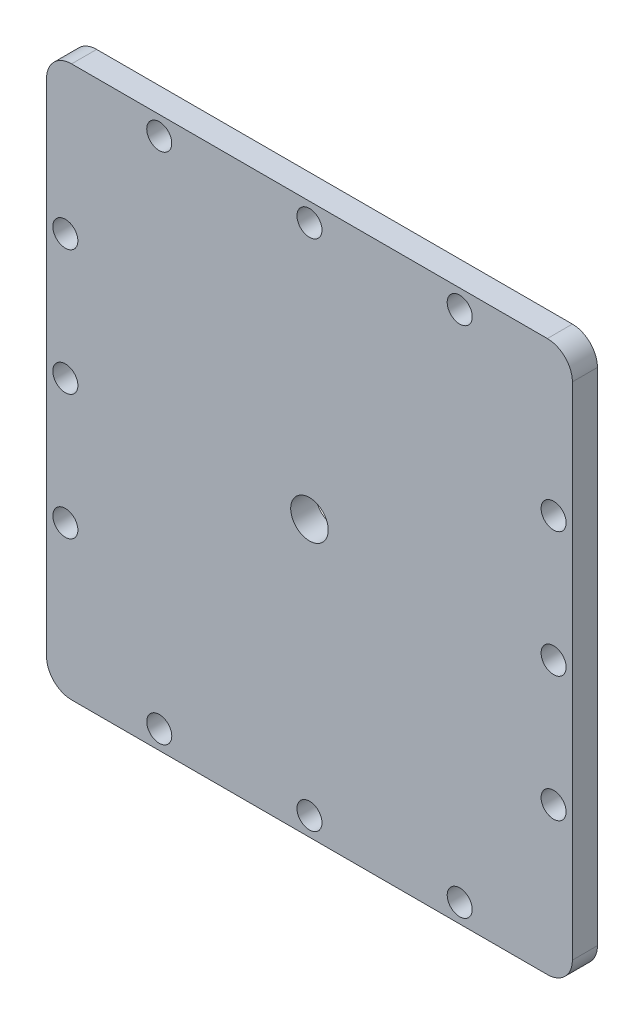
ISO-10303-21;
HEADER;
FILE_DESCRIPTION(('STEP AP214'),'2;1');
FILE_NAME('part.step','',(''),(''),'','','');
FILE_SCHEMA(('AUTOMOTIVE_DESIGN { 1 0 10303 214 1 1 1 1 }'));
ENDSEC;
DATA;
#1=APPLICATION_CONTEXT('core data for automotive mechanical design processes');
#2=APPLICATION_PROTOCOL_DEFINITION('international standard','automotive_design',2000,#1);
#3=PRODUCT_CONTEXT('',#1,'mechanical');
#4=PRODUCT('Part','Part','',(#3));
#5=PRODUCT_RELATED_PRODUCT_CATEGORY('part','',(#4));
#6=PRODUCT_DEFINITION_FORMATION('','',#4);
#7=PRODUCT_DEFINITION_CONTEXT('part definition',#1,'design');
#8=PRODUCT_DEFINITION('design','',#6,#7);
#9=PRODUCT_DEFINITION_SHAPE('','',#8);
#10=(LENGTH_UNIT() NAMED_UNIT(*) SI_UNIT(.MILLI.,.METRE.));
#11=(NAMED_UNIT(*) PLANE_ANGLE_UNIT() SI_UNIT($,.RADIAN.));
#12=(NAMED_UNIT(*) SI_UNIT($,.STERADIAN.) SOLID_ANGLE_UNIT());
#13=UNCERTAINTY_MEASURE_WITH_UNIT(LENGTH_MEASURE(1.E-05),#10,'distance_accuracy_value','');
#14=(GEOMETRIC_REPRESENTATION_CONTEXT(3) GLOBAL_UNCERTAINTY_ASSIGNED_CONTEXT((#13)) GLOBAL_UNIT_ASSIGNED_CONTEXT((#10,
#11,#12)) REPRESENTATION_CONTEXT('',''));
#15=CARTESIAN_POINT('',(0.,0.,0.));
#16=DIRECTION('',(0.,0.,1.));
#17=DIRECTION('',(1.,0.,0.));
#18=AXIS2_PLACEMENT_3D('',#15,#16,#17);
#19=CARTESIAN_POINT('',(95.,100.,10.));
#20=DIRECTION('',(0.,0.,-1.));
#21=DIRECTION('',(-1.,0.,0.));
#22=AXIS2_PLACEMENT_3D('',#19,#20,#21);
#23=PLANE('',#22);
#24=CARTESIAN_POINT('',(0.,0.,10.));
#25=DIRECTION('',(0.,0.,1.));
#26=DIRECTION('',(1.,0.,0.));
#27=AXIS2_PLACEMENT_3D('',#24,#25,#26);
#28=CIRCLE('',#27,7.5);
#29=CARTESIAN_POINT('',(7.5,0.,10.));
#30=VERTEX_POINT('',#29);
#31=EDGE_CURVE('E304',#30,#30,#28,.T.);
#32=ORIENTED_EDGE('',*,*,#31,.F.);
#33=EDGE_LOOP('',(#32));
#34=FACE_BOUND('',#33,.T.);
#35=CARTESIAN_POINT('',(95.,100.,10.));
#36=DIRECTION('',(0.,0.,1.));
#37=DIRECTION('',(-1.,0.,0.));
#38=AXIS2_PLACEMENT_3D('',#35,#36,#37);
#39=CIRCLE('',#38,9.99999999999999);
#40=CARTESIAN_POINT('',(105.,100.,10.));
#41=VERTEX_POINT('',#40);
#42=CARTESIAN_POINT('',(95.,110.,10.));
#43=VERTEX_POINT('',#42);
#44=EDGE_CURVE('E163',#41,#43,#39,.T.);
#45=ORIENTED_EDGE('',*,*,#44,.T.);
#46=DIRECTION('',(-1.,0.,0.));
#47=VECTOR('',#46,1.);
#48=CARTESIAN_POINT('',(-95.,110.,10.));
#49=LINE('',#48,#47);
#50=CARTESIAN_POINT('',(-95.,110.,10.));
#51=VERTEX_POINT('',#50);
#52=EDGE_CURVE('E99',#43,#51,#49,.T.);
#53=ORIENTED_EDGE('',*,*,#52,.T.);
#54=CARTESIAN_POINT('',(-95.,100.,10.));
#55=DIRECTION('',(0.,0.,1.));
#56=DIRECTION('',(-1.,0.,0.));
#57=AXIS2_PLACEMENT_3D('',#54,#55,#56);
#58=CIRCLE('',#57,10.);
#59=CARTESIAN_POINT('',(-105.,100.,10.));
#60=VERTEX_POINT('',#59);
#61=EDGE_CURVE('E184',#51,#60,#58,.T.);
#62=ORIENTED_EDGE('',*,*,#61,.T.);
#63=DIRECTION('',(0.,-1.,0.));
#64=VECTOR('',#63,1.);
#65=CARTESIAN_POINT('',(-105.,-100.,10.));
#66=LINE('',#65,#64);
#67=CARTESIAN_POINT('',(-105.,-100.,10.));
#68=VERTEX_POINT('',#67);
#69=EDGE_CURVE('E198',#60,#68,#66,.T.);
#70=ORIENTED_EDGE('',*,*,#69,.T.);
#71=CARTESIAN_POINT('',(-95.,-100.,10.));
#72=DIRECTION('',(0.,0.,1.));
#73=DIRECTION('',(-1.,0.,0.));
#74=AXIS2_PLACEMENT_3D('',#71,#72,#73);
#75=CIRCLE('',#74,9.99999999999999);
#76=CARTESIAN_POINT('',(-95.,-110.,10.));
#77=VERTEX_POINT('',#76);
#78=EDGE_CURVE('E118',#68,#77,#75,.T.);
#79=ORIENTED_EDGE('',*,*,#78,.T.);
#80=DIRECTION('',(1.,0.,0.));
#81=VECTOR('',#80,1.);
#82=CARTESIAN_POINT('',(-95.,-110.,10.));
#83=LINE('',#82,#81);
#84=CARTESIAN_POINT('',(95.,-110.,10.));
#85=VERTEX_POINT('',#84);
#86=EDGE_CURVE('E112',#77,#85,#83,.T.);
#87=ORIENTED_EDGE('',*,*,#86,.T.);
#88=CARTESIAN_POINT('',(95.,-100.,10.));
#89=DIRECTION('',(0.,0.,1.));
#90=DIRECTION('',(1.,0.,0.));
#91=AXIS2_PLACEMENT_3D('',#88,#89,#90);
#92=CIRCLE('',#91,9.99999999999999);
#93=CARTESIAN_POINT('',(105.,-100.,10.));
#94=VERTEX_POINT('',#93);
#95=EDGE_CURVE('E116',#85,#94,#92,.T.);
#96=ORIENTED_EDGE('',*,*,#95,.T.);
#97=DIRECTION('',(0.,1.,0.));
#98=VECTOR('',#97,1.);
#99=CARTESIAN_POINT('',(105.,-100.,10.));
#100=LINE('',#99,#98);
#101=EDGE_CURVE('E56',#94,#41,#100,.T.);
#102=ORIENTED_EDGE('',*,*,#101,.T.);
#103=EDGE_LOOP('',(#45,#53,#62,#70,#79,#87,#96,#102));
#104=FACE_BOUND('',#103,.T.);
#105=CARTESIAN_POINT('',(97.5,0.,10.));
#106=DIRECTION('',(0.,0.,1.));
#107=DIRECTION('',(1.,0.,0.));
#108=AXIS2_PLACEMENT_3D('',#105,#106,#107);
#109=CIRCLE('',#108,4.99999999999999);
#110=CARTESIAN_POINT('',(102.5,0.,10.));
#111=VERTEX_POINT('',#110);
#112=EDGE_CURVE('E145',#111,#111,#109,.T.);
#113=ORIENTED_EDGE('',*,*,#112,.F.);
#114=EDGE_LOOP('',(#113));
#115=FACE_BOUND('',#114,.T.);
#116=CARTESIAN_POINT('',(0.,102.5,10.));
#117=DIRECTION('',(0.,0.,1.));
#118=DIRECTION('',(1.,0.,0.));
#119=AXIS2_PLACEMENT_3D('',#116,#117,#118);
#120=CIRCLE('',#119,5.00000000000001);
#121=CARTESIAN_POINT('',(5.00000000000001,102.5,10.));
#122=VERTEX_POINT('',#121);
#123=EDGE_CURVE('E212',#122,#122,#120,.T.);
#124=ORIENTED_EDGE('',*,*,#123,.F.);
#125=EDGE_LOOP('',(#124));
#126=FACE_BOUND('',#125,.T.);
#127=CARTESIAN_POINT('',(60.,102.5,10.));
#128=DIRECTION('',(0.,0.,1.));
#129=DIRECTION('',(1.,0.,0.));
#130=AXIS2_PLACEMENT_3D('',#127,#128,#129);
#131=CIRCLE('',#130,5.00000000000002);
#132=CARTESIAN_POINT('',(65.,102.5,10.));
#133=VERTEX_POINT('',#132);
#134=EDGE_CURVE('E220',#133,#133,#131,.T.);
#135=ORIENTED_EDGE('',*,*,#134,.F.);
#136=EDGE_LOOP('',(#135));
#137=FACE_BOUND('',#136,.T.);
#138=CARTESIAN_POINT('',(97.5,50.,10.));
#139=DIRECTION('',(0.,0.,1.));
#140=DIRECTION('',(1.,0.,0.));
#141=AXIS2_PLACEMENT_3D('',#138,#139,#140);
#142=CIRCLE('',#141,4.99999999999999);
#143=CARTESIAN_POINT('',(102.5,50.,10.));
#144=VERTEX_POINT('',#143);
#145=EDGE_CURVE('E228',#144,#144,#142,.T.);
#146=ORIENTED_EDGE('',*,*,#145,.F.);
#147=EDGE_LOOP('',(#146));
#148=FACE_BOUND('',#147,.T.);
#149=CARTESIAN_POINT('',(97.5,-50.0000000000001,10.));
#150=DIRECTION('',(0.,0.,1.));
#151=DIRECTION('',(-1.,0.,0.));
#152=AXIS2_PLACEMENT_3D('',#149,#150,#151);
#153=CIRCLE('',#152,4.99999999999999);
#154=CARTESIAN_POINT('',(92.5,-50.0000000000001,10.));
#155=VERTEX_POINT('',#154);
#156=EDGE_CURVE('E236',#155,#155,#153,.T.);
#157=ORIENTED_EDGE('',*,*,#156,.F.);
#158=EDGE_LOOP('',(#157));
#159=FACE_BOUND('',#158,.T.);
#160=CARTESIAN_POINT('',(60.,-102.5,10.));
#161=DIRECTION('',(0.,0.,1.));
#162=DIRECTION('',(-1.,0.,0.));
#163=AXIS2_PLACEMENT_3D('',#160,#161,#162);
#164=CIRCLE('',#163,5.00000000000002);
#165=CARTESIAN_POINT('',(55.,-102.5,10.));
#166=VERTEX_POINT('',#165);
#167=EDGE_CURVE('E244',#166,#166,#164,.T.);
#168=ORIENTED_EDGE('',*,*,#167,.F.);
#169=EDGE_LOOP('',(#168));
#170=FACE_BOUND('',#169,.T.);
#171=CARTESIAN_POINT('',(0.,-102.5,10.));
#172=DIRECTION('',(0.,0.,1.));
#173=DIRECTION('',(-1.,0.,0.));
#174=AXIS2_PLACEMENT_3D('',#171,#172,#173);
#175=CIRCLE('',#174,5.00000000000001);
#176=CARTESIAN_POINT('',(-5.00000000000001,-102.5,10.));
#177=VERTEX_POINT('',#176);
#178=EDGE_CURVE('E252',#177,#177,#175,.T.);
#179=ORIENTED_EDGE('',*,*,#178,.F.);
#180=EDGE_LOOP('',(#179));
#181=FACE_BOUND('',#180,.T.);
#182=CARTESIAN_POINT('',(-60.,102.5,10.));
#183=DIRECTION('',(0.,0.,1.));
#184=DIRECTION('',(-1.,0.,0.));
#185=AXIS2_PLACEMENT_3D('',#182,#183,#184);
#186=CIRCLE('',#185,5.00000000000001);
#187=CARTESIAN_POINT('',(-65.,102.5,10.));
#188=VERTEX_POINT('',#187);
#189=EDGE_CURVE('E260',#188,#188,#186,.T.);
#190=ORIENTED_EDGE('',*,*,#189,.F.);
#191=EDGE_LOOP('',(#190));
#192=FACE_BOUND('',#191,.T.);
#193=CARTESIAN_POINT('',(-60.,-102.5,10.));
#194=DIRECTION('',(0.,0.,1.));
#195=DIRECTION('',(1.,0.,0.));
#196=AXIS2_PLACEMENT_3D('',#193,#194,#195);
#197=CIRCLE('',#196,5.00000000000001);
#198=CARTESIAN_POINT('',(-55.,-102.5,10.));
#199=VERTEX_POINT('',#198);
#200=EDGE_CURVE('E268',#199,#199,#197,.T.);
#201=ORIENTED_EDGE('',*,*,#200,.F.);
#202=EDGE_LOOP('',(#201));
#203=FACE_BOUND('',#202,.T.);
#204=CARTESIAN_POINT('',(-97.5,-50.0000000000001,10.));
#205=DIRECTION('',(0.,0.,1.));
#206=DIRECTION('',(1.,0.,0.));
#207=AXIS2_PLACEMENT_3D('',#204,#205,#206);
#208=CIRCLE('',#207,5.00000000000001);
#209=CARTESIAN_POINT('',(-92.5,-50.0000000000001,10.));
#210=VERTEX_POINT('',#209);
#211=EDGE_CURVE('E276',#210,#210,#208,.T.);
#212=ORIENTED_EDGE('',*,*,#211,.F.);
#213=EDGE_LOOP('',(#212));
#214=FACE_BOUND('',#213,.T.);
#215=CARTESIAN_POINT('',(-97.5,0.,10.));
#216=DIRECTION('',(0.,0.,1.));
#217=DIRECTION('',(-1.,0.,0.));
#218=AXIS2_PLACEMENT_3D('',#215,#216,#217);
#219=CIRCLE('',#218,5.);
#220=CARTESIAN_POINT('',(-102.5,0.,10.));
#221=VERTEX_POINT('',#220);
#222=EDGE_CURVE('E284',#221,#221,#219,.T.);
#223=ORIENTED_EDGE('',*,*,#222,.F.);
#224=EDGE_LOOP('',(#223));
#225=FACE_BOUND('',#224,.T.);
#226=CARTESIAN_POINT('',(-97.5,50.,10.));
#227=DIRECTION('',(0.,0.,1.));
#228=DIRECTION('',(-1.,0.,0.));
#229=AXIS2_PLACEMENT_3D('',#226,#227,#228);
#230=CIRCLE('',#229,5.00000000000001);
#231=CARTESIAN_POINT('',(-102.5,50.,10.));
#232=VERTEX_POINT('',#231);
#233=EDGE_CURVE('E292',#232,#232,#230,.T.);
#234=ORIENTED_EDGE('',*,*,#233,.F.);
#235=EDGE_LOOP('',(#234));
#236=FACE_BOUND('',#235,.T.);
#237=ADVANCED_FACE('F38',(#34,#104,#115,#126,#137,#148,#159,#170,#181,#192,#203,#214,#225,#236),
#23,.F.);
#238=CARTESIAN_POINT('',(95.,100.,0.));
#239=DIRECTION('',(0.,0.,-1.));
#240=DIRECTION('',(-1.,0.,0.));
#241=AXIS2_PLACEMENT_3D('',#238,#239,#240);
#242=PLANE('',#241);
#243=CARTESIAN_POINT('',(0.,0.,0.));
#244=DIRECTION('',(0.,0.,1.));
#245=DIRECTION('',(1.,0.,0.));
#246=AXIS2_PLACEMENT_3D('',#243,#244,#245);
#247=CIRCLE('',#246,7.5);
#248=CARTESIAN_POINT('',(7.5,0.,0.));
#249=VERTEX_POINT('',#248);
#250=EDGE_CURVE('E300',#249,#249,#247,.T.);
#251=ORIENTED_EDGE('',*,*,#250,.T.);
#252=EDGE_LOOP('',(#251));
#253=FACE_BOUND('',#252,.T.);
#254=CARTESIAN_POINT('',(-97.5,0.,0.));
#255=DIRECTION('',(0.,0.,1.));
#256=DIRECTION('',(-1.,0.,0.));
#257=AXIS2_PLACEMENT_3D('',#254,#255,#256);
#258=CIRCLE('',#257,5.);
#259=CARTESIAN_POINT('',(-102.5,0.,0.));
#260=VERTEX_POINT('',#259);
#261=EDGE_CURVE('E288',#260,#260,#258,.T.);
#262=ORIENTED_EDGE('',*,*,#261,.T.);
#263=EDGE_LOOP('',(#262));
#264=FACE_BOUND('',#263,.T.);
#265=CARTESIAN_POINT('',(-60.,-102.5,0.));
#266=DIRECTION('',(0.,0.,1.));
#267=DIRECTION('',(1.,0.,0.));
#268=AXIS2_PLACEMENT_3D('',#265,#266,#267);
#269=CIRCLE('',#268,5.00000000000001);
#270=CARTESIAN_POINT('',(-55.,-102.5,0.));
#271=VERTEX_POINT('',#270);
#272=EDGE_CURVE('E272',#271,#271,#269,.T.);
#273=ORIENTED_EDGE('',*,*,#272,.T.);
#274=EDGE_LOOP('',(#273));
#275=FACE_BOUND('',#274,.T.);
#276=CARTESIAN_POINT('',(0.,-102.5,0.));
#277=DIRECTION('',(0.,0.,1.));
#278=DIRECTION('',(-1.,0.,0.));
#279=AXIS2_PLACEMENT_3D('',#276,#277,#278);
#280=CIRCLE('',#279,5.00000000000001);
#281=CARTESIAN_POINT('',(-5.00000000000001,-102.5,0.));
#282=VERTEX_POINT('',#281);
#283=EDGE_CURVE('E256',#282,#282,#280,.T.);
#284=ORIENTED_EDGE('',*,*,#283,.T.);
#285=EDGE_LOOP('',(#284));
#286=FACE_BOUND('',#285,.T.);
#287=CARTESIAN_POINT('',(97.5,-50.0000000000001,0.));
#288=DIRECTION('',(0.,0.,1.));
#289=DIRECTION('',(-1.,0.,0.));
#290=AXIS2_PLACEMENT_3D('',#287,#288,#289);
#291=CIRCLE('',#290,4.99999999999999);
#292=CARTESIAN_POINT('',(92.5,-50.0000000000001,0.));
#293=VERTEX_POINT('',#292);
#294=EDGE_CURVE('E240',#293,#293,#291,.T.);
#295=ORIENTED_EDGE('',*,*,#294,.T.);
#296=EDGE_LOOP('',(#295));
#297=FACE_BOUND('',#296,.T.);
#298=CARTESIAN_POINT('',(60.,102.5,0.));
#299=DIRECTION('',(0.,0.,1.));
#300=DIRECTION('',(1.,0.,0.));
#301=AXIS2_PLACEMENT_3D('',#298,#299,#300);
#302=CIRCLE('',#301,5.00000000000002);
#303=CARTESIAN_POINT('',(65.,102.5,0.));
#304=VERTEX_POINT('',#303);
#305=EDGE_CURVE('E224',#304,#304,#302,.T.);
#306=ORIENTED_EDGE('',*,*,#305,.T.);
#307=EDGE_LOOP('',(#306));
#308=FACE_BOUND('',#307,.T.);
#309=CARTESIAN_POINT('',(97.5,0.,0.));
#310=DIRECTION('',(0.,0.,1.));
#311=DIRECTION('',(1.,0.,0.));
#312=AXIS2_PLACEMENT_3D('',#309,#310,#311);
#313=CIRCLE('',#312,4.99999999999999);
#314=CARTESIAN_POINT('',(102.5,0.,0.));
#315=VERTEX_POINT('',#314);
#316=EDGE_CURVE('E208',#315,#315,#313,.T.);
#317=ORIENTED_EDGE('',*,*,#316,.T.);
#318=EDGE_LOOP('',(#317));
#319=FACE_BOUND('',#318,.T.);
#320=CARTESIAN_POINT('',(95.,100.,0.));
#321=DIRECTION('',(0.,0.,1.));
#322=DIRECTION('',(-1.,0.,0.));
#323=AXIS2_PLACEMENT_3D('',#320,#321,#322);
#324=CIRCLE('',#323,9.99999999999999);
#325=CARTESIAN_POINT('',(105.,100.,0.));
#326=VERTEX_POINT('',#325);
#327=CARTESIAN_POINT('',(95.,110.,0.));
#328=VERTEX_POINT('',#327);
#329=EDGE_CURVE('E140',#326,#328,#324,.T.);
#330=ORIENTED_EDGE('',*,*,#329,.F.);
#331=DIRECTION('',(0.,1.,0.));
#332=VECTOR('',#331,1.);
#333=CARTESIAN_POINT('',(105.,-100.,0.));
#334=LINE('',#333,#332);
#335=CARTESIAN_POINT('',(105.,-100.,0.));
#336=VERTEX_POINT('',#335);
#337=EDGE_CURVE('E91',#336,#326,#334,.T.);
#338=ORIENTED_EDGE('',*,*,#337,.F.);
#339=CARTESIAN_POINT('',(95.,-100.,0.));
#340=DIRECTION('',(0.,0.,1.));
#341=DIRECTION('',(1.,0.,0.));
#342=AXIS2_PLACEMENT_3D('',#339,#340,#341);
#343=CIRCLE('',#342,9.99999999999999);
#344=CARTESIAN_POINT('',(95.,-110.,0.));
#345=VERTEX_POINT('',#344);
#346=EDGE_CURVE('E85',#345,#336,#343,.T.);
#347=ORIENTED_EDGE('',*,*,#346,.F.);
#348=DIRECTION('',(1.,0.,0.));
#349=VECTOR('',#348,1.);
#350=CARTESIAN_POINT('',(-95.,-110.,0.));
#351=LINE('',#350,#349);
#352=CARTESIAN_POINT('',(-95.,-110.,0.));
#353=VERTEX_POINT('',#352);
#354=EDGE_CURVE('E127',#353,#345,#351,.T.);
#355=ORIENTED_EDGE('',*,*,#354,.F.);
#356=CARTESIAN_POINT('',(-95.,-100.,0.));
#357=DIRECTION('',(0.,0.,1.));
#358=DIRECTION('',(-1.,0.,0.));
#359=AXIS2_PLACEMENT_3D('',#356,#357,#358);
#360=CIRCLE('',#359,9.99999999999999);
#361=CARTESIAN_POINT('',(-105.,-100.,0.));
#362=VERTEX_POINT('',#361);
#363=EDGE_CURVE('E154',#362,#353,#360,.T.);
#364=ORIENTED_EDGE('',*,*,#363,.F.);
#365=DIRECTION('',(0.,-1.,0.));
#366=VECTOR('',#365,1.);
#367=CARTESIAN_POINT('',(-105.,-100.,0.));
#368=LINE('',#367,#366);
#369=CARTESIAN_POINT('',(-105.,100.,0.));
#370=VERTEX_POINT('',#369);
#371=EDGE_CURVE('E151',#370,#362,#368,.T.);
#372=ORIENTED_EDGE('',*,*,#371,.F.);
#373=CARTESIAN_POINT('',(-95.,100.,0.));
#374=DIRECTION('',(0.,0.,1.));
#375=DIRECTION('',(-1.,0.,0.));
#376=AXIS2_PLACEMENT_3D('',#373,#374,#375);
#377=CIRCLE('',#376,10.);
#378=CARTESIAN_POINT('',(-95.,110.,0.));
#379=VERTEX_POINT('',#378);
#380=EDGE_CURVE('E148',#379,#370,#377,.T.);
#381=ORIENTED_EDGE('',*,*,#380,.F.);
#382=DIRECTION('',(-1.,0.,0.));
#383=VECTOR('',#382,1.);
#384=CARTESIAN_POINT('',(-95.,110.,0.));
#385=LINE('',#384,#383);
#386=EDGE_CURVE('E144',#328,#379,#385,.T.);
#387=ORIENTED_EDGE('',*,*,#386,.F.);
#388=EDGE_LOOP('',(#330,#338,#347,#355,#364,#372,#381,#387));
#389=FACE_BOUND('',#388,.T.);
#390=CARTESIAN_POINT('',(0.,102.5,0.));
#391=DIRECTION('',(0.,0.,1.));
#392=DIRECTION('',(1.,0.,0.));
#393=AXIS2_PLACEMENT_3D('',#390,#391,#392);
#394=CIRCLE('',#393,5.00000000000001);
#395=CARTESIAN_POINT('',(5.00000000000001,102.5,0.));
#396=VERTEX_POINT('',#395);
#397=EDGE_CURVE('E216',#396,#396,#394,.T.);
#398=ORIENTED_EDGE('',*,*,#397,.T.);
#399=EDGE_LOOP('',(#398));
#400=FACE_BOUND('',#399,.T.);
#401=CARTESIAN_POINT('',(97.5,50.,0.));
#402=DIRECTION('',(0.,0.,1.));
#403=DIRECTION('',(1.,0.,0.));
#404=AXIS2_PLACEMENT_3D('',#401,#402,#403);
#405=CIRCLE('',#404,4.99999999999999);
#406=CARTESIAN_POINT('',(102.5,50.,0.));
#407=VERTEX_POINT('',#406);
#408=EDGE_CURVE('E232',#407,#407,#405,.T.);
#409=ORIENTED_EDGE('',*,*,#408,.T.);
#410=EDGE_LOOP('',(#409));
#411=FACE_BOUND('',#410,.T.);
#412=CARTESIAN_POINT('',(60.,-102.5,0.));
#413=DIRECTION('',(0.,0.,1.));
#414=DIRECTION('',(-1.,0.,0.));
#415=AXIS2_PLACEMENT_3D('',#412,#413,#414);
#416=CIRCLE('',#415,5.00000000000002);
#417=CARTESIAN_POINT('',(55.,-102.5,0.));
#418=VERTEX_POINT('',#417);
#419=EDGE_CURVE('E248',#418,#418,#416,.T.);
#420=ORIENTED_EDGE('',*,*,#419,.T.);
#421=EDGE_LOOP('',(#420));
#422=FACE_BOUND('',#421,.T.);
#423=CARTESIAN_POINT('',(-60.,102.5,0.));
#424=DIRECTION('',(0.,0.,1.));
#425=DIRECTION('',(-1.,0.,0.));
#426=AXIS2_PLACEMENT_3D('',#423,#424,#425);
#427=CIRCLE('',#426,5.00000000000001);
#428=CARTESIAN_POINT('',(-65.,102.5,0.));
#429=VERTEX_POINT('',#428);
#430=EDGE_CURVE('E264',#429,#429,#427,.T.);
#431=ORIENTED_EDGE('',*,*,#430,.T.);
#432=EDGE_LOOP('',(#431));
#433=FACE_BOUND('',#432,.T.);
#434=CARTESIAN_POINT('',(-97.5,-50.0000000000001,0.));
#435=DIRECTION('',(0.,0.,1.));
#436=DIRECTION('',(1.,0.,0.));
#437=AXIS2_PLACEMENT_3D('',#434,#435,#436);
#438=CIRCLE('',#437,5.00000000000001);
#439=CARTESIAN_POINT('',(-92.5,-50.0000000000001,0.));
#440=VERTEX_POINT('',#439);
#441=EDGE_CURVE('E280',#440,#440,#438,.T.);
#442=ORIENTED_EDGE('',*,*,#441,.T.);
#443=EDGE_LOOP('',(#442));
#444=FACE_BOUND('',#443,.T.);
#445=CARTESIAN_POINT('',(-97.5,50.,0.));
#446=DIRECTION('',(0.,0.,1.));
#447=DIRECTION('',(-1.,0.,0.));
#448=AXIS2_PLACEMENT_3D('',#445,#446,#447);
#449=CIRCLE('',#448,5.00000000000001);
#450=CARTESIAN_POINT('',(-102.5,50.,0.));
#451=VERTEX_POINT('',#450);
#452=EDGE_CURVE('E296',#451,#451,#449,.T.);
#453=ORIENTED_EDGE('',*,*,#452,.T.);
#454=EDGE_LOOP('',(#453));
#455=FACE_BOUND('',#454,.T.);
#456=ADVANCED_FACE('F188',(#253,#264,#275,#286,#297,#308,#319,#389,#400,#411,#422,#433,#444,
#455),#242,.T.);
#457=CARTESIAN_POINT('',(95.,100.,10.));
#458=DIRECTION('',(0.,0.,-1.));
#459=DIRECTION('',(-1.,0.,0.));
#460=AXIS2_PLACEMENT_3D('',#457,#458,#459);
#461=CYLINDRICAL_SURFACE('',#460,9.99999999999999);
#462=ORIENTED_EDGE('',*,*,#329,.T.);
#463=DIRECTION('',(0.,0.,-1.));
#464=VECTOR('',#463,1.);
#465=CARTESIAN_POINT('',(95.,110.,10.));
#466=LINE('',#465,#464);
#467=EDGE_CURVE('E11',#43,#328,#466,.T.);
#468=ORIENTED_EDGE('',*,*,#467,.F.);
#469=ORIENTED_EDGE('',*,*,#44,.F.);
#470=DIRECTION('',(0.,0.,-1.));
#471=VECTOR('',#470,1.);
#472=CARTESIAN_POINT('',(105.,100.,10.));
#473=LINE('',#472,#471);
#474=EDGE_CURVE('E136',#41,#326,#473,.T.);
#475=ORIENTED_EDGE('',*,*,#474,.T.);
#476=EDGE_LOOP('',(#462,#468,#469,#475));
#477=FACE_BOUND('',#476,.T.);
#478=ADVANCED_FACE('F40',(#477),#461,.T.);
#479=CARTESIAN_POINT('',(-95.,110.,10.));
#480=DIRECTION('',(0.,-1.,0.));
#481=DIRECTION('',(0.,0.,-1.));
#482=AXIS2_PLACEMENT_3D('',#479,#480,#481);
#483=PLANE('',#482);
#484=ORIENTED_EDGE('',*,*,#386,.T.);
#485=DIRECTION('',(0.,0.,-1.));
#486=VECTOR('',#485,1.);
#487=CARTESIAN_POINT('',(-95.,110.,10.));
#488=LINE('',#487,#486);
#489=EDGE_CURVE('E48',#51,#379,#488,.T.);
#490=ORIENTED_EDGE('',*,*,#489,.F.);
#491=ORIENTED_EDGE('',*,*,#52,.F.);
#492=ORIENTED_EDGE('',*,*,#467,.T.);
#493=EDGE_LOOP('',(#484,#490,#491,#492));
#494=FACE_BOUND('',#493,.T.);
#495=ADVANCED_FACE('F344',(#494),#483,.F.);
#496=CARTESIAN_POINT('',(-95.,100.,10.));
#497=DIRECTION('',(0.,0.,-1.));
#498=DIRECTION('',(-1.,0.,0.));
#499=AXIS2_PLACEMENT_3D('',#496,#497,#498);
#500=CYLINDRICAL_SURFACE('',#499,10.);
#501=ORIENTED_EDGE('',*,*,#380,.T.);
#502=DIRECTION('',(0.,0.,-1.));
#503=VECTOR('',#502,1.);
#504=CARTESIAN_POINT('',(-105.,100.,10.));
#505=LINE('',#504,#503);
#506=EDGE_CURVE('E174',#60,#370,#505,.T.);
#507=ORIENTED_EDGE('',*,*,#506,.F.);
#508=ORIENTED_EDGE('',*,*,#61,.F.);
#509=ORIENTED_EDGE('',*,*,#489,.T.);
#510=EDGE_LOOP('',(#501,#507,#508,#509));
#511=FACE_BOUND('',#510,.T.);
#512=ADVANCED_FACE('F182',(#511),#500,.T.);
#513=CARTESIAN_POINT('',(-105.,-100.,10.));
#514=DIRECTION('',(1.,0.,0.));
#515=DIRECTION('',(0.,0.,-1.));
#516=AXIS2_PLACEMENT_3D('',#513,#514,#515);
#517=PLANE('',#516);
#518=ORIENTED_EDGE('',*,*,#371,.T.);
#519=DIRECTION('',(0.,0.,-1.));
#520=VECTOR('',#519,1.);
#521=CARTESIAN_POINT('',(-105.,-100.,10.));
#522=LINE('',#521,#520);
#523=EDGE_CURVE('E170',#68,#362,#522,.T.);
#524=ORIENTED_EDGE('',*,*,#523,.F.);
#525=ORIENTED_EDGE('',*,*,#69,.F.);
#526=ORIENTED_EDGE('',*,*,#506,.T.);
#527=EDGE_LOOP('',(#518,#524,#525,#526));
#528=FACE_BOUND('',#527,.T.);
#529=ADVANCED_FACE('F193',(#528),#517,.F.);
#530=CARTESIAN_POINT('',(-95.,-100.,10.));
#531=DIRECTION('',(0.,0.,-1.));
#532=DIRECTION('',(-1.,0.,0.));
#533=AXIS2_PLACEMENT_3D('',#530,#531,#532);
#534=CYLINDRICAL_SURFACE('',#533,9.99999999999999);
#535=ORIENTED_EDGE('',*,*,#363,.T.);
#536=DIRECTION('',(0.,0.,-1.));
#537=VECTOR('',#536,1.);
#538=CARTESIAN_POINT('',(-95.,-110.,10.));
#539=LINE('',#538,#537);
#540=EDGE_CURVE('E129',#77,#353,#539,.T.);
#541=ORIENTED_EDGE('',*,*,#540,.F.);
#542=ORIENTED_EDGE('',*,*,#78,.F.);
#543=ORIENTED_EDGE('',*,*,#523,.T.);
#544=EDGE_LOOP('',(#535,#541,#542,#543));
#545=FACE_BOUND('',#544,.T.);
#546=ADVANCED_FACE('F196',(#545),#534,.T.);
#547=CARTESIAN_POINT('',(-95.,-110.,10.));
#548=DIRECTION('',(0.,1.,0.));
#549=DIRECTION('',(0.,0.,1.));
#550=AXIS2_PLACEMENT_3D('',#547,#548,#549);
#551=PLANE('',#550);
#552=ORIENTED_EDGE('',*,*,#354,.T.);
#553=DIRECTION('',(0.,0.,-1.));
#554=VECTOR('',#553,1.);
#555=CARTESIAN_POINT('',(95.,-110.,10.));
#556=LINE('',#555,#554);
#557=EDGE_CURVE('E124',#85,#345,#556,.T.);
#558=ORIENTED_EDGE('',*,*,#557,.F.);
#559=ORIENTED_EDGE('',*,*,#86,.F.);
#560=ORIENTED_EDGE('',*,*,#540,.T.);
#561=EDGE_LOOP('',(#552,#558,#559,#560));
#562=FACE_BOUND('',#561,.T.);
#563=ADVANCED_FACE('F125',(#562),#551,.F.);
#564=CARTESIAN_POINT('',(95.,-100.,10.));
#565=DIRECTION('',(0.,0.,-1.));
#566=DIRECTION('',(-1.,0.,0.));
#567=AXIS2_PLACEMENT_3D('',#564,#565,#566);
#568=CYLINDRICAL_SURFACE('',#567,9.99999999999999);
#569=ORIENTED_EDGE('',*,*,#346,.T.);
#570=DIRECTION('',(0.,0.,-1.));
#571=VECTOR('',#570,1.);
#572=CARTESIAN_POINT('',(105.,-100.,10.));
#573=LINE('',#572,#571);
#574=EDGE_CURVE('E130',#94,#336,#573,.T.);
#575=ORIENTED_EDGE('',*,*,#574,.F.);
#576=ORIENTED_EDGE('',*,*,#95,.F.);
#577=ORIENTED_EDGE('',*,*,#557,.T.);
#578=EDGE_LOOP('',(#569,#575,#576,#577));
#579=FACE_BOUND('',#578,.T.);
#580=ADVANCED_FACE('F132',(#579),#568,.T.);
#581=CARTESIAN_POINT('',(105.,-100.,10.));
#582=DIRECTION('',(-1.,0.,0.));
#583=DIRECTION('',(0.,0.,1.));
#584=AXIS2_PLACEMENT_3D('',#581,#582,#583);
#585=PLANE('',#584);
#586=ORIENTED_EDGE('',*,*,#337,.T.);
#587=ORIENTED_EDGE('',*,*,#474,.F.);
#588=ORIENTED_EDGE('',*,*,#101,.F.);
#589=ORIENTED_EDGE('',*,*,#574,.T.);
#590=EDGE_LOOP('',(#586,#587,#588,#589));
#591=FACE_BOUND('',#590,.T.);
#592=ADVANCED_FACE('F332',(#591),#585,.F.);
#593=CARTESIAN_POINT('',(97.5,0.,10.));
#594=DIRECTION('',(0.,0.,-1.));
#595=DIRECTION('',(-1.,0.,0.));
#596=AXIS2_PLACEMENT_3D('',#593,#594,#595);
#597=CYLINDRICAL_SURFACE('',#596,4.99999999999999);
#598=ORIENTED_EDGE('',*,*,#112,.T.);
#599=EDGE_LOOP('',(#598));
#600=FACE_BOUND('',#599,.T.);
#601=ORIENTED_EDGE('',*,*,#316,.F.);
#602=EDGE_LOOP('',(#601));
#603=FACE_BOUND('',#602,.T.);
#604=ADVANCED_FACE('F329',(#600,#603),#597,.F.);
#605=CARTESIAN_POINT('',(0.,102.5,10.));
#606=DIRECTION('',(0.,0.,-1.));
#607=DIRECTION('',(-1.,0.,0.));
#608=AXIS2_PLACEMENT_3D('',#605,#606,#607);
#609=CYLINDRICAL_SURFACE('',#608,5.00000000000001);
#610=ORIENTED_EDGE('',*,*,#123,.T.);
#611=EDGE_LOOP('',(#610));
#612=FACE_BOUND('',#611,.T.);
#613=ORIENTED_EDGE('',*,*,#397,.F.);
#614=EDGE_LOOP('',(#613));
#615=FACE_BOUND('',#614,.T.);
#616=ADVANCED_FACE('F447',(#612,#615),#609,.F.);
#617=CARTESIAN_POINT('',(60.,102.5,10.));
#618=DIRECTION('',(0.,0.,-1.));
#619=DIRECTION('',(-1.,0.,0.));
#620=AXIS2_PLACEMENT_3D('',#617,#618,#619);
#621=CYLINDRICAL_SURFACE('',#620,5.00000000000002);
#622=ORIENTED_EDGE('',*,*,#134,.T.);
#623=EDGE_LOOP('',(#622));
#624=FACE_BOUND('',#623,.T.);
#625=ORIENTED_EDGE('',*,*,#305,.F.);
#626=EDGE_LOOP('',(#625));
#627=FACE_BOUND('',#626,.T.);
#628=ADVANCED_FACE('F439',(#624,#627),#621,.F.);
#629=CARTESIAN_POINT('',(97.5,50.,10.));
#630=DIRECTION('',(0.,0.,-1.));
#631=DIRECTION('',(-1.,0.,0.));
#632=AXIS2_PLACEMENT_3D('',#629,#630,#631);
#633=CYLINDRICAL_SURFACE('',#632,4.99999999999999);
#634=ORIENTED_EDGE('',*,*,#145,.T.);
#635=EDGE_LOOP('',(#634));
#636=FACE_BOUND('',#635,.T.);
#637=ORIENTED_EDGE('',*,*,#408,.F.);
#638=EDGE_LOOP('',(#637));
#639=FACE_BOUND('',#638,.T.);
#640=ADVANCED_FACE('F431',(#636,#639),#633,.F.);
#641=CARTESIAN_POINT('',(97.5,-50.0000000000001,10.));
#642=DIRECTION('',(0.,0.,-1.));
#643=DIRECTION('',(-1.,0.,0.));
#644=AXIS2_PLACEMENT_3D('',#641,#642,#643);
#645=CYLINDRICAL_SURFACE('',#644,4.99999999999999);
#646=ORIENTED_EDGE('',*,*,#156,.T.);
#647=EDGE_LOOP('',(#646));
#648=FACE_BOUND('',#647,.T.);
#649=ORIENTED_EDGE('',*,*,#294,.F.);
#650=EDGE_LOOP('',(#649));
#651=FACE_BOUND('',#650,.T.);
#652=ADVANCED_FACE('F423',(#648,#651),#645,.F.);
#653=CARTESIAN_POINT('',(60.,-102.5,10.));
#654=DIRECTION('',(0.,0.,-1.));
#655=DIRECTION('',(-1.,0.,0.));
#656=AXIS2_PLACEMENT_3D('',#653,#654,#655);
#657=CYLINDRICAL_SURFACE('',#656,5.00000000000002);
#658=ORIENTED_EDGE('',*,*,#167,.T.);
#659=EDGE_LOOP('',(#658));
#660=FACE_BOUND('',#659,.T.);
#661=ORIENTED_EDGE('',*,*,#419,.F.);
#662=EDGE_LOOP('',(#661));
#663=FACE_BOUND('',#662,.T.);
#664=ADVANCED_FACE('F415',(#660,#663),#657,.F.);
#665=CARTESIAN_POINT('',(0.,-102.5,10.));
#666=DIRECTION('',(0.,0.,-1.));
#667=DIRECTION('',(-1.,0.,0.));
#668=AXIS2_PLACEMENT_3D('',#665,#666,#667);
#669=CYLINDRICAL_SURFACE('',#668,5.00000000000001);
#670=ORIENTED_EDGE('',*,*,#178,.T.);
#671=EDGE_LOOP('',(#670));
#672=FACE_BOUND('',#671,.T.);
#673=ORIENTED_EDGE('',*,*,#283,.F.);
#674=EDGE_LOOP('',(#673));
#675=FACE_BOUND('',#674,.T.);
#676=ADVANCED_FACE('F407',(#672,#675),#669,.F.);
#677=CARTESIAN_POINT('',(-60.,102.5,10.));
#678=DIRECTION('',(0.,0.,-1.));
#679=DIRECTION('',(-1.,0.,0.));
#680=AXIS2_PLACEMENT_3D('',#677,#678,#679);
#681=CYLINDRICAL_SURFACE('',#680,5.00000000000001);
#682=ORIENTED_EDGE('',*,*,#189,.T.);
#683=EDGE_LOOP('',(#682));
#684=FACE_BOUND('',#683,.T.);
#685=ORIENTED_EDGE('',*,*,#430,.F.);
#686=EDGE_LOOP('',(#685));
#687=FACE_BOUND('',#686,.T.);
#688=ADVANCED_FACE('F399',(#684,#687),#681,.F.);
#689=CARTESIAN_POINT('',(-60.,-102.5,10.));
#690=DIRECTION('',(0.,0.,-1.));
#691=DIRECTION('',(-1.,0.,0.));
#692=AXIS2_PLACEMENT_3D('',#689,#690,#691);
#693=CYLINDRICAL_SURFACE('',#692,5.00000000000001);
#694=ORIENTED_EDGE('',*,*,#200,.T.);
#695=EDGE_LOOP('',(#694));
#696=FACE_BOUND('',#695,.T.);
#697=ORIENTED_EDGE('',*,*,#272,.F.);
#698=EDGE_LOOP('',(#697));
#699=FACE_BOUND('',#698,.T.);
#700=ADVANCED_FACE('F391',(#696,#699),#693,.F.);
#701=CARTESIAN_POINT('',(-97.5,-50.0000000000001,10.));
#702=DIRECTION('',(0.,0.,-1.));
#703=DIRECTION('',(-1.,0.,0.));
#704=AXIS2_PLACEMENT_3D('',#701,#702,#703);
#705=CYLINDRICAL_SURFACE('',#704,5.00000000000001);
#706=ORIENTED_EDGE('',*,*,#211,.T.);
#707=EDGE_LOOP('',(#706));
#708=FACE_BOUND('',#707,.T.);
#709=ORIENTED_EDGE('',*,*,#441,.F.);
#710=EDGE_LOOP('',(#709));
#711=FACE_BOUND('',#710,.T.);
#712=ADVANCED_FACE('F383',(#708,#711),#705,.F.);
#713=CARTESIAN_POINT('',(-97.5,0.,10.));
#714=DIRECTION('',(0.,0.,-1.));
#715=DIRECTION('',(-1.,0.,0.));
#716=AXIS2_PLACEMENT_3D('',#713,#714,#715);
#717=CYLINDRICAL_SURFACE('',#716,5.);
#718=ORIENTED_EDGE('',*,*,#222,.T.);
#719=EDGE_LOOP('',(#718));
#720=FACE_BOUND('',#719,.T.);
#721=ORIENTED_EDGE('',*,*,#261,.F.);
#722=EDGE_LOOP('',(#721));
#723=FACE_BOUND('',#722,.T.);
#724=ADVANCED_FACE('F376',(#720,#723),#717,.F.);
#725=CARTESIAN_POINT('',(-97.5,50.,10.));
#726=DIRECTION('',(0.,0.,-1.));
#727=DIRECTION('',(-1.,0.,0.));
#728=AXIS2_PLACEMENT_3D('',#725,#726,#727);
#729=CYLINDRICAL_SURFACE('',#728,5.00000000000001);
#730=ORIENTED_EDGE('',*,*,#233,.T.);
#731=EDGE_LOOP('',(#730));
#732=FACE_BOUND('',#731,.T.);
#733=ORIENTED_EDGE('',*,*,#452,.F.);
#734=EDGE_LOOP('',(#733));
#735=FACE_BOUND('',#734,.T.);
#736=ADVANCED_FACE('F317',(#732,#735),#729,.F.);
#737=CARTESIAN_POINT('',(0.,0.,0.));
#738=DIRECTION('',(0.,0.,1.));
#739=DIRECTION('',(1.,0.,0.));
#740=AXIS2_PLACEMENT_3D('',#737,#738,#739);
#741=CYLINDRICAL_SURFACE('',#740,7.5);
#742=ORIENTED_EDGE('',*,*,#250,.F.);
#743=EDGE_LOOP('',(#742));
#744=FACE_BOUND('',#743,.T.);
#745=ORIENTED_EDGE('',*,*,#31,.T.);
#746=EDGE_LOOP('',(#745));
#747=FACE_BOUND('',#746,.T.);
#748=ADVANCED_FACE('F314',(#744,#747),#741,.F.);
#749=CLOSED_SHELL('',(#237,#456,#478,#495,#512,#529,#546,#563,#580,#592,#604,#616,#628,#640,
#652,#664,#676,#688,#700,#712,#724,#736,#748));
#750=MANIFOLD_SOLID_BREP('B2',#749);
#751=ADVANCED_BREP_SHAPE_REPRESENTATION('',(#18,#750),#14);
#752=SHAPE_DEFINITION_REPRESENTATION(#9,#751);
ENDSEC;
END-ISO-10303-21;
